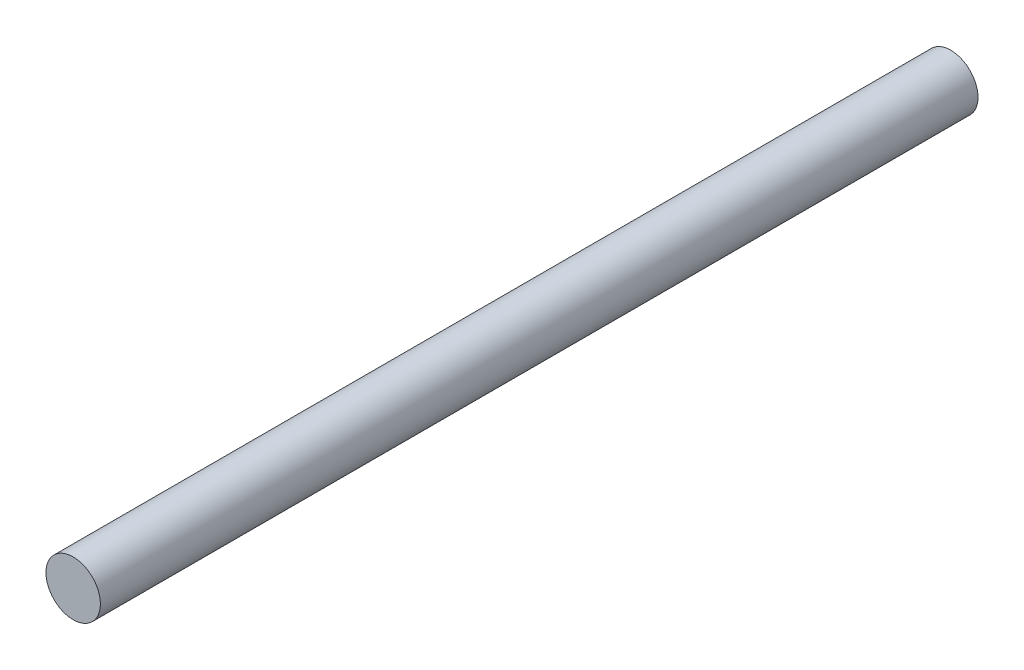
ISO-10303-21;
HEADER;
FILE_DESCRIPTION(('STEP AP214'),'2;1');
FILE_NAME('part.step','',(''),(''),'','','');
FILE_SCHEMA(('AUTOMOTIVE_DESIGN { 1 0 10303 214 1 1 1 1 }'));
ENDSEC;
DATA;
#1=APPLICATION_CONTEXT('core data for automotive mechanical design processes');
#2=APPLICATION_PROTOCOL_DEFINITION('international standard','automotive_design',2000,#1);
#3=PRODUCT_CONTEXT('',#1,'mechanical');
#4=PRODUCT('Part','Part','',(#3));
#5=PRODUCT_RELATED_PRODUCT_CATEGORY('part','',(#4));
#6=PRODUCT_DEFINITION_FORMATION('','',#4);
#7=PRODUCT_DEFINITION_CONTEXT('part definition',#1,'design');
#8=PRODUCT_DEFINITION('design','',#6,#7);
#9=PRODUCT_DEFINITION_SHAPE('','',#8);
#10=(LENGTH_UNIT() NAMED_UNIT(*) SI_UNIT(.MILLI.,.METRE.));
#11=(NAMED_UNIT(*) PLANE_ANGLE_UNIT() SI_UNIT($,.RADIAN.));
#12=(NAMED_UNIT(*) SI_UNIT($,.STERADIAN.) SOLID_ANGLE_UNIT());
#13=UNCERTAINTY_MEASURE_WITH_UNIT(LENGTH_MEASURE(1.E-05),#10,'distance_accuracy_value','');
#14=(GEOMETRIC_REPRESENTATION_CONTEXT(3) GLOBAL_UNCERTAINTY_ASSIGNED_CONTEXT((#13)) GLOBAL_UNIT_ASSIGNED_CONTEXT((#10,
#11,#12)) REPRESENTATION_CONTEXT('',''));
#15=CARTESIAN_POINT('',(0.,0.,0.));
#16=DIRECTION('',(0.,0.,1.));
#17=DIRECTION('',(1.,0.,0.));
#18=AXIS2_PLACEMENT_3D('',#15,#16,#17);
#19=CARTESIAN_POINT('',(0.,0.,48.364941752572));
#20=DIRECTION('',(0.,0.,-1.));
#21=DIRECTION('',(-1.,0.,0.));
#22=AXIS2_PLACEMENT_3D('',#19,#20,#21);
#23=CYLINDRICAL_SURFACE('',#22,1.5);
#24=CARTESIAN_POINT('',(0.,0.,48.364941752572));
#25=DIRECTION('',(0.,0.,1.));
#26=DIRECTION('',(1.,0.,0.));
#27=AXIS2_PLACEMENT_3D('',#24,#25,#26);
#28=CIRCLE('',#27,1.5);
#29=CARTESIAN_POINT('',(1.5,0.,48.364941752572));
#30=VERTEX_POINT('',#29);
#31=EDGE_CURVE('E10',#30,#30,#28,.T.);
#32=ORIENTED_EDGE('',*,*,#31,.F.);
#33=EDGE_LOOP('',(#32));
#34=FACE_BOUND('',#33,.T.);
#35=CARTESIAN_POINT('',(0.,0.,0.));
#36=DIRECTION('',(0.,0.,1.));
#37=DIRECTION('',(1.,0.,0.));
#38=AXIS2_PLACEMENT_3D('',#35,#36,#37);
#39=CIRCLE('',#38,1.5);
#40=CARTESIAN_POINT('',(1.5,0.,0.));
#41=VERTEX_POINT('',#40);
#42=EDGE_CURVE('E37',#41,#41,#39,.T.);
#43=ORIENTED_EDGE('',*,*,#42,.T.);
#44=EDGE_LOOP('',(#43));
#45=FACE_BOUND('',#44,.T.);
#46=ADVANCED_FACE('F40',(#34,#45),#23,.T.);
#47=CARTESIAN_POINT('',(0.,0.,48.364941752572));
#48=DIRECTION('',(0.,0.,1.));
#49=DIRECTION('',(1.,0.,0.));
#50=AXIS2_PLACEMENT_3D('',#47,#48,#49);
#51=PLANE('',#50);
#52=ORIENTED_EDGE('',*,*,#31,.T.);
#53=EDGE_LOOP('',(#52));
#54=FACE_BOUND('',#53,.T.);
#55=ADVANCED_FACE('F55',(#54),#51,.T.);
#56=CARTESIAN_POINT('',(0.,0.,0.));
#57=DIRECTION('',(0.,0.,1.));
#58=DIRECTION('',(1.,0.,0.));
#59=AXIS2_PLACEMENT_3D('',#56,#57,#58);
#60=PLANE('',#59);
#61=ORIENTED_EDGE('',*,*,#42,.F.);
#62=EDGE_LOOP('',(#61));
#63=FACE_BOUND('',#62,.T.);
#64=ADVANCED_FACE('F49',(#63),#60,.F.);
#65=CLOSED_SHELL('',(#46,#55,#64));
#66=MANIFOLD_SOLID_BREP('B2',#65);
#67=ADVANCED_BREP_SHAPE_REPRESENTATION('',(#18,#66),#14);
#68=SHAPE_DEFINITION_REPRESENTATION(#9,#67);
ENDSEC;
END-ISO-10303-21;
